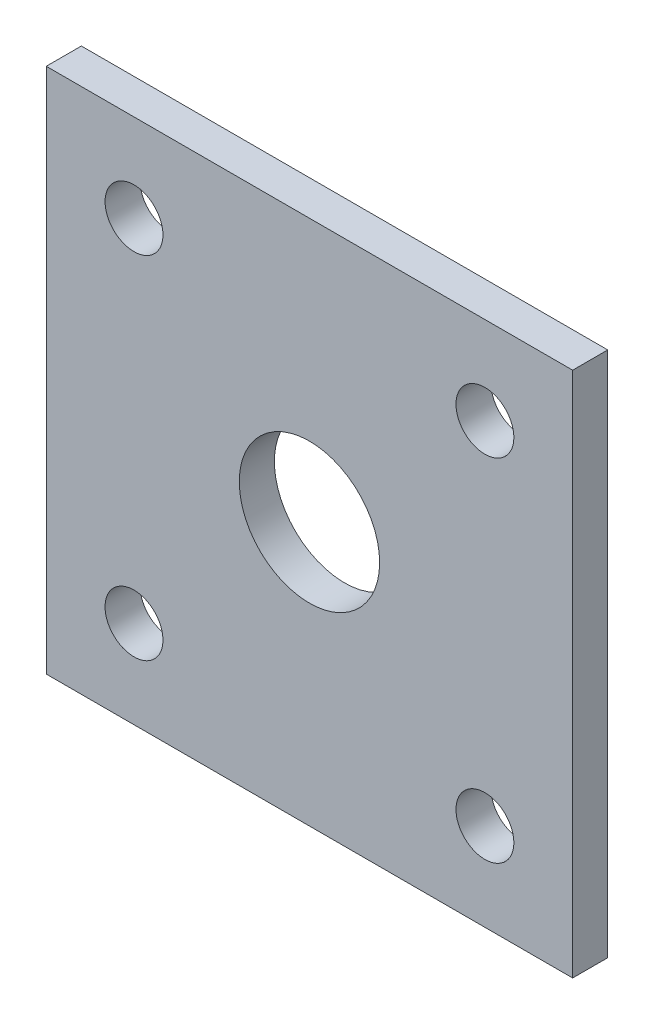
ISO-10303-21;
HEADER;
FILE_DESCRIPTION(('STEP AP214'),'2;1');
FILE_NAME('part.step','',(''),(''),'','','');
FILE_SCHEMA(('AUTOMOTIVE_DESIGN { 1 0 10303 214 1 1 1 1 }'));
ENDSEC;
DATA;
#1=APPLICATION_CONTEXT('core data for automotive mechanical design processes');
#2=APPLICATION_PROTOCOL_DEFINITION('international standard','automotive_design',2000,#1);
#3=PRODUCT_CONTEXT('',#1,'mechanical');
#4=PRODUCT('Part','Part','',(#3));
#5=PRODUCT_RELATED_PRODUCT_CATEGORY('part','',(#4));
#6=PRODUCT_DEFINITION_FORMATION('','',#4);
#7=PRODUCT_DEFINITION_CONTEXT('part definition',#1,'design');
#8=PRODUCT_DEFINITION('design','',#6,#7);
#9=PRODUCT_DEFINITION_SHAPE('','',#8);
#10=(LENGTH_UNIT() NAMED_UNIT(*) SI_UNIT(.MILLI.,.METRE.));
#11=(NAMED_UNIT(*) PLANE_ANGLE_UNIT() SI_UNIT($,.RADIAN.));
#12=(NAMED_UNIT(*) SI_UNIT($,.STERADIAN.) SOLID_ANGLE_UNIT());
#13=UNCERTAINTY_MEASURE_WITH_UNIT(LENGTH_MEASURE(1.E-05),#10,'distance_accuracy_value','');
#14=(GEOMETRIC_REPRESENTATION_CONTEXT(3) GLOBAL_UNCERTAINTY_ASSIGNED_CONTEXT((#13)) GLOBAL_UNIT_ASSIGNED_CONTEXT((#10,
#11,#12)) REPRESENTATION_CONTEXT('',''));
#15=CARTESIAN_POINT('',(0.,0.,0.));
#16=DIRECTION('',(0.,0.,1.));
#17=DIRECTION('',(1.,0.,0.));
#18=AXIS2_PLACEMENT_3D('',#15,#16,#17);
#19=CARTESIAN_POINT('',(0.,0.,2.));
#20=DIRECTION('',(0.,0.,1.));
#21=DIRECTION('',(1.,0.,0.));
#22=AXIS2_PLACEMENT_3D('',#19,#20,#21);
#23=PLANE('',#22);
#24=CARTESIAN_POINT('',(-21.2913444685399,4.54255955253956,2.));
#25=DIRECTION('',(0.,0.,1.));
#26=DIRECTION('',(1.,0.,0.));
#27=AXIS2_PLACEMENT_3D('',#24,#25,#26);
#28=CIRCLE('',#27,1.64999999999999);
#29=CARTESIAN_POINT('',(-19.6413444685399,4.54255955253956,2.));
#30=VERTEX_POINT('',#29);
#31=EDGE_CURVE('E127',#30,#30,#28,.T.);
#32=ORIENTED_EDGE('',*,*,#31,.F.);
#33=EDGE_LOOP('',(#32));
#34=FACE_BOUND('',#33,.T.);
#35=CARTESIAN_POINT('',(-31.2913444685399,14.5425595525395,2.));
#36=DIRECTION('',(0.,0.,1.));
#37=DIRECTION('',(1.,0.,0.));
#38=AXIS2_PLACEMENT_3D('',#35,#36,#37);
#39=CIRCLE('',#38,4.);
#40=CARTESIAN_POINT('',(-27.2913444685399,14.5425595525395,2.));
#41=VERTEX_POINT('',#40);
#42=EDGE_CURVE('E115',#41,#41,#39,.T.);
#43=ORIENTED_EDGE('',*,*,#42,.F.);
#44=EDGE_LOOP('',(#43));
#45=FACE_BOUND('',#44,.T.);
#46=DIRECTION('',(0.,-1.,0.));
#47=VECTOR('',#46,1.);
#48=CARTESIAN_POINT('',(-46.2913444685401,29.5425595525393,2.));
#49=LINE('',#48,#47);
#50=CARTESIAN_POINT('',(-46.2913444685401,29.5425595525393,2.));
#51=VERTEX_POINT('',#50);
#52=CARTESIAN_POINT('',(-46.2913444685401,-0.457440447460652,2.));
#53=VERTEX_POINT('',#52);
#54=EDGE_CURVE('E85',#51,#53,#49,.T.);
#55=ORIENTED_EDGE('',*,*,#54,.T.);
#56=DIRECTION('',(1.,0.,0.));
#57=VECTOR('',#56,1.);
#58=CARTESIAN_POINT('',(-46.2913444685401,-0.457440447460652,2.));
#59=LINE('',#58,#57);
#60=CARTESIAN_POINT('',(-16.2913444685401,-0.457440447460652,2.));
#61=VERTEX_POINT('',#60);
#62=EDGE_CURVE('E80',#53,#61,#59,.T.);
#63=ORIENTED_EDGE('',*,*,#62,.T.);
#64=DIRECTION('',(0.,1.,0.));
#65=VECTOR('',#64,1.);
#66=CARTESIAN_POINT('',(-16.2913444685401,29.5425595525393,2.));
#67=LINE('',#66,#65);
#68=CARTESIAN_POINT('',(-16.2913444685401,29.5425595525393,2.));
#69=VERTEX_POINT('',#68);
#70=EDGE_CURVE('E83',#61,#69,#67,.T.);
#71=ORIENTED_EDGE('',*,*,#70,.T.);
#72=DIRECTION('',(-1.,0.,0.));
#73=VECTOR('',#72,1.);
#74=CARTESIAN_POINT('',(-46.2913444685401,29.5425595525393,2.));
#75=LINE('',#74,#73);
#76=EDGE_CURVE('E50',#69,#51,#75,.T.);
#77=ORIENTED_EDGE('',*,*,#76,.T.);
#78=EDGE_LOOP('',(#55,#63,#71,#77));
#79=FACE_BOUND('',#78,.T.);
#80=CARTESIAN_POINT('',(-41.2913444685401,24.5425595525393,2.));
#81=DIRECTION('',(0.,0.,1.));
#82=DIRECTION('',(1.,0.,0.));
#83=AXIS2_PLACEMENT_3D('',#80,#81,#82);
#84=CIRCLE('',#83,1.65);
#85=CARTESIAN_POINT('',(-39.6413444685401,24.5425595525393,2.));
#86=VERTEX_POINT('',#85);
#87=EDGE_CURVE('E100',#86,#86,#84,.T.);
#88=ORIENTED_EDGE('',*,*,#87,.F.);
#89=EDGE_LOOP('',(#88));
#90=FACE_BOUND('',#89,.T.);
#91=CARTESIAN_POINT('',(-21.29134446854,24.5425595525396,2.));
#92=DIRECTION('',(0.,0.,1.));
#93=DIRECTION('',(1.,0.,0.));
#94=AXIS2_PLACEMENT_3D('',#91,#92,#93);
#95=CIRCLE('',#94,1.65);
#96=CARTESIAN_POINT('',(-19.64134446854,24.5425595525396,2.));
#97=VERTEX_POINT('',#96);
#98=EDGE_CURVE('E121',#97,#97,#95,.T.);
#99=ORIENTED_EDGE('',*,*,#98,.F.);
#100=EDGE_LOOP('',(#99));
#101=FACE_BOUND('',#100,.T.);
#102=CARTESIAN_POINT('',(-41.2913444685399,4.54255955253945,2.));
#103=DIRECTION('',(0.,0.,1.));
#104=DIRECTION('',(1.,0.,0.));
#105=AXIS2_PLACEMENT_3D('',#102,#103,#104);
#106=CIRCLE('',#105,1.65);
#107=CARTESIAN_POINT('',(-39.6413444685399,4.54255955253945,2.));
#108=VERTEX_POINT('',#107);
#109=EDGE_CURVE('E133',#108,#108,#106,.T.);
#110=ORIENTED_EDGE('',*,*,#109,.F.);
#111=EDGE_LOOP('',(#110));
#112=FACE_BOUND('',#111,.T.);
#113=ADVANCED_FACE('F33',(#34,#45,#79,#90,#101,#112),#23,.T.);
#114=CARTESIAN_POINT('',(0.,0.,0.));
#115=DIRECTION('',(0.,0.,1.));
#116=DIRECTION('',(1.,0.,0.));
#117=AXIS2_PLACEMENT_3D('',#114,#115,#116);
#118=PLANE('',#117);
#119=DIRECTION('',(0.,-1.,0.));
#120=VECTOR('',#119,1.);
#121=CARTESIAN_POINT('',(-46.2913444685401,29.5425595525393,0.));
#122=LINE('',#121,#120);
#123=CARTESIAN_POINT('',(-46.2913444685401,29.5425595525393,0.));
#124=VERTEX_POINT('',#123);
#125=CARTESIAN_POINT('',(-46.2913444685401,-0.457440447460652,0.));
#126=VERTEX_POINT('',#125);
#127=EDGE_CURVE('E97',#124,#126,#122,.T.);
#128=ORIENTED_EDGE('',*,*,#127,.F.);
#129=DIRECTION('',(-1.,0.,0.));
#130=VECTOR('',#129,1.);
#131=CARTESIAN_POINT('',(-46.2913444685401,29.5425595525393,0.));
#132=LINE('',#131,#130);
#133=CARTESIAN_POINT('',(-16.2913444685401,29.5425595525393,0.));
#134=VERTEX_POINT('',#133);
#135=EDGE_CURVE('E73',#134,#124,#132,.T.);
#136=ORIENTED_EDGE('',*,*,#135,.F.);
#137=DIRECTION('',(0.,1.,0.));
#138=VECTOR('',#137,1.);
#139=CARTESIAN_POINT('',(-16.2913444685401,29.5425595525393,0.));
#140=LINE('',#139,#138);
#141=CARTESIAN_POINT('',(-16.2913444685401,-0.457440447460652,0.));
#142=VERTEX_POINT('',#141);
#143=EDGE_CURVE('E67',#142,#134,#140,.T.);
#144=ORIENTED_EDGE('',*,*,#143,.F.);
#145=DIRECTION('',(1.,0.,0.));
#146=VECTOR('',#145,1.);
#147=CARTESIAN_POINT('',(-46.2913444685401,-0.457440447460652,0.));
#148=LINE('',#147,#146);
#149=EDGE_CURVE('E89',#126,#142,#148,.T.);
#150=ORIENTED_EDGE('',*,*,#149,.F.);
#151=EDGE_LOOP('',(#128,#136,#144,#150));
#152=FACE_BOUND('',#151,.T.);
#153=CARTESIAN_POINT('',(-41.2913444685401,24.5425595525393,0.));
#154=DIRECTION('',(0.,0.,1.));
#155=DIRECTION('',(1.,0.,0.));
#156=AXIS2_PLACEMENT_3D('',#153,#154,#155);
#157=CIRCLE('',#156,1.65);
#158=CARTESIAN_POINT('',(-39.6413444685401,24.5425595525393,0.));
#159=VERTEX_POINT('',#158);
#160=EDGE_CURVE('E112',#159,#159,#157,.T.);
#161=ORIENTED_EDGE('',*,*,#160,.T.);
#162=EDGE_LOOP('',(#161));
#163=FACE_BOUND('',#162,.T.);
#164=CARTESIAN_POINT('',(-31.2913444685399,14.5425595525395,0.));
#165=DIRECTION('',(0.,0.,1.));
#166=DIRECTION('',(1.,0.,0.));
#167=AXIS2_PLACEMENT_3D('',#164,#165,#166);
#168=CIRCLE('',#167,4.);
#169=CARTESIAN_POINT('',(-27.2913444685399,14.5425595525395,0.));
#170=VERTEX_POINT('',#169);
#171=EDGE_CURVE('E118',#170,#170,#168,.T.);
#172=ORIENTED_EDGE('',*,*,#171,.T.);
#173=EDGE_LOOP('',(#172));
#174=FACE_BOUND('',#173,.T.);
#175=CARTESIAN_POINT('',(-21.29134446854,24.5425595525396,0.));
#176=DIRECTION('',(0.,0.,1.));
#177=DIRECTION('',(1.,0.,0.));
#178=AXIS2_PLACEMENT_3D('',#175,#176,#177);
#179=CIRCLE('',#178,1.65);
#180=CARTESIAN_POINT('',(-19.64134446854,24.5425595525396,0.));
#181=VERTEX_POINT('',#180);
#182=EDGE_CURVE('E124',#181,#181,#179,.T.);
#183=ORIENTED_EDGE('',*,*,#182,.T.);
#184=EDGE_LOOP('',(#183));
#185=FACE_BOUND('',#184,.T.);
#186=CARTESIAN_POINT('',(-21.2913444685399,4.54255955253956,0.));
#187=DIRECTION('',(0.,0.,1.));
#188=DIRECTION('',(1.,0.,0.));
#189=AXIS2_PLACEMENT_3D('',#186,#187,#188);
#190=CIRCLE('',#189,1.64999999999999);
#191=CARTESIAN_POINT('',(-19.6413444685399,4.54255955253956,0.));
#192=VERTEX_POINT('',#191);
#193=EDGE_CURVE('E130',#192,#192,#190,.T.);
#194=ORIENTED_EDGE('',*,*,#193,.T.);
#195=EDGE_LOOP('',(#194));
#196=FACE_BOUND('',#195,.T.);
#197=CARTESIAN_POINT('',(-41.2913444685399,4.54255955253945,0.));
#198=DIRECTION('',(0.,0.,1.));
#199=DIRECTION('',(1.,0.,0.));
#200=AXIS2_PLACEMENT_3D('',#197,#198,#199);
#201=CIRCLE('',#200,1.65);
#202=CARTESIAN_POINT('',(-39.6413444685399,4.54255955253945,0.));
#203=VERTEX_POINT('',#202);
#204=EDGE_CURVE('E136',#203,#203,#201,.T.);
#205=ORIENTED_EDGE('',*,*,#204,.T.);
#206=EDGE_LOOP('',(#205));
#207=FACE_BOUND('',#206,.T.);
#208=ADVANCED_FACE('F108',(#152,#163,#174,#185,#196,#207),#118,.F.);
#209=CARTESIAN_POINT('',(-46.2913444685401,29.5425595525393,2.));
#210=DIRECTION('',(1.,0.,0.));
#211=DIRECTION('',(0.,1.,0.));
#212=AXIS2_PLACEMENT_3D('',#209,#210,#211);
#213=PLANE('',#212);
#214=ORIENTED_EDGE('',*,*,#127,.T.);
#215=DIRECTION('',(0.,0.,-1.));
#216=VECTOR('',#215,1.);
#217=CARTESIAN_POINT('',(-46.2913444685401,-0.457440447460652,2.));
#218=LINE('',#217,#216);
#219=EDGE_CURVE('E11',#53,#126,#218,.T.);
#220=ORIENTED_EDGE('',*,*,#219,.F.);
#221=ORIENTED_EDGE('',*,*,#54,.F.);
#222=DIRECTION('',(0.,0.,-1.));
#223=VECTOR('',#222,1.);
#224=CARTESIAN_POINT('',(-46.2913444685401,29.5425595525393,2.));
#225=LINE('',#224,#223);
#226=EDGE_CURVE('E93',#51,#124,#225,.T.);
#227=ORIENTED_EDGE('',*,*,#226,.T.);
#228=EDGE_LOOP('',(#214,#220,#221,#227));
#229=FACE_BOUND('',#228,.T.);
#230=ADVANCED_FACE('F35',(#229),#213,.F.);
#231=CARTESIAN_POINT('',(-46.2913444685401,-0.457440447460652,2.));
#232=DIRECTION('',(0.,1.,0.));
#233=DIRECTION('',(0.,0.,1.));
#234=AXIS2_PLACEMENT_3D('',#231,#232,#233);
#235=PLANE('',#234);
#236=ORIENTED_EDGE('',*,*,#149,.T.);
#237=DIRECTION('',(0.,0.,-1.));
#238=VECTOR('',#237,1.);
#239=CARTESIAN_POINT('',(-16.2913444685401,-0.457440447460652,2.));
#240=LINE('',#239,#238);
#241=EDGE_CURVE('E42',#61,#142,#240,.T.);
#242=ORIENTED_EDGE('',*,*,#241,.F.);
#243=ORIENTED_EDGE('',*,*,#62,.F.);
#244=ORIENTED_EDGE('',*,*,#219,.T.);
#245=EDGE_LOOP('',(#236,#242,#243,#244));
#246=FACE_BOUND('',#245,.T.);
#247=ADVANCED_FACE('F88',(#246),#235,.F.);
#248=CARTESIAN_POINT('',(-16.2913444685401,29.5425595525393,2.));
#249=DIRECTION('',(-1.,0.,0.));
#250=DIRECTION('',(0.,-1.,0.));
#251=AXIS2_PLACEMENT_3D('',#248,#249,#250);
#252=PLANE('',#251);
#253=ORIENTED_EDGE('',*,*,#143,.T.);
#254=DIRECTION('',(0.,0.,-1.));
#255=VECTOR('',#254,1.);
#256=CARTESIAN_POINT('',(-16.2913444685401,29.5425595525393,2.));
#257=LINE('',#256,#255);
#258=EDGE_CURVE('E90',#69,#134,#257,.T.);
#259=ORIENTED_EDGE('',*,*,#258,.F.);
#260=ORIENTED_EDGE('',*,*,#70,.F.);
#261=ORIENTED_EDGE('',*,*,#241,.T.);
#262=EDGE_LOOP('',(#253,#259,#260,#261));
#263=FACE_BOUND('',#262,.T.);
#264=ADVANCED_FACE('F91',(#263),#252,.F.);
#265=CARTESIAN_POINT('',(-46.2913444685401,29.5425595525393,2.));
#266=DIRECTION('',(0.,-1.,0.));
#267=DIRECTION('',(0.,0.,-1.));
#268=AXIS2_PLACEMENT_3D('',#265,#266,#267);
#269=PLANE('',#268);
#270=ORIENTED_EDGE('',*,*,#135,.T.);
#271=ORIENTED_EDGE('',*,*,#226,.F.);
#272=ORIENTED_EDGE('',*,*,#76,.F.);
#273=ORIENTED_EDGE('',*,*,#258,.T.);
#274=EDGE_LOOP('',(#270,#271,#272,#273));
#275=FACE_BOUND('',#274,.T.);
#276=ADVANCED_FACE('F105',(#275),#269,.F.);
#277=CARTESIAN_POINT('',(-41.2913444685401,24.5425595525393,2.));
#278=DIRECTION('',(0.,0.,-1.));
#279=DIRECTION('',(-1.,0.,0.));
#280=AXIS2_PLACEMENT_3D('',#277,#278,#279);
#281=CYLINDRICAL_SURFACE('',#280,1.65);
#282=ORIENTED_EDGE('',*,*,#87,.T.);
#283=EDGE_LOOP('',(#282));
#284=FACE_BOUND('',#283,.T.);
#285=ORIENTED_EDGE('',*,*,#160,.F.);
#286=EDGE_LOOP('',(#285));
#287=FACE_BOUND('',#286,.T.);
#288=ADVANCED_FACE('F155',(#284,#287),#281,.F.);
#289=CARTESIAN_POINT('',(-31.2913444685399,14.5425595525395,2.));
#290=DIRECTION('',(0.,0.,-1.));
#291=DIRECTION('',(-1.,0.,0.));
#292=AXIS2_PLACEMENT_3D('',#289,#290,#291);
#293=CYLINDRICAL_SURFACE('',#292,4.);
#294=ORIENTED_EDGE('',*,*,#42,.T.);
#295=EDGE_LOOP('',(#294));
#296=FACE_BOUND('',#295,.T.);
#297=ORIENTED_EDGE('',*,*,#171,.F.);
#298=EDGE_LOOP('',(#297));
#299=FACE_BOUND('',#298,.T.);
#300=ADVANCED_FACE('F201',(#296,#299),#293,.F.);
#301=CARTESIAN_POINT('',(-21.29134446854,24.5425595525396,2.));
#302=DIRECTION('',(0.,0.,-1.));
#303=DIRECTION('',(-1.,0.,0.));
#304=AXIS2_PLACEMENT_3D('',#301,#302,#303);
#305=CYLINDRICAL_SURFACE('',#304,1.65);
#306=ORIENTED_EDGE('',*,*,#98,.T.);
#307=EDGE_LOOP('',(#306));
#308=FACE_BOUND('',#307,.T.);
#309=ORIENTED_EDGE('',*,*,#182,.F.);
#310=EDGE_LOOP('',(#309));
#311=FACE_BOUND('',#310,.T.);
#312=ADVANCED_FACE('F209',(#308,#311),#305,.F.);
#313=CARTESIAN_POINT('',(-21.2913444685399,4.54255955253956,2.));
#314=DIRECTION('',(0.,0.,-1.));
#315=DIRECTION('',(-1.,0.,0.));
#316=AXIS2_PLACEMENT_3D('',#313,#314,#315);
#317=CYLINDRICAL_SURFACE('',#316,1.64999999999999);
#318=ORIENTED_EDGE('',*,*,#31,.T.);
#319=EDGE_LOOP('',(#318));
#320=FACE_BOUND('',#319,.T.);
#321=ORIENTED_EDGE('',*,*,#193,.F.);
#322=EDGE_LOOP('',(#321));
#323=FACE_BOUND('',#322,.T.);
#324=ADVANCED_FACE('F217',(#320,#323),#317,.F.);
#325=CARTESIAN_POINT('',(-41.2913444685399,4.54255955253945,2.));
#326=DIRECTION('',(0.,0.,-1.));
#327=DIRECTION('',(-1.,0.,0.));
#328=AXIS2_PLACEMENT_3D('',#325,#326,#327);
#329=CYLINDRICAL_SURFACE('',#328,1.65);
#330=ORIENTED_EDGE('',*,*,#109,.T.);
#331=EDGE_LOOP('',(#330));
#332=FACE_BOUND('',#331,.T.);
#333=ORIENTED_EDGE('',*,*,#204,.F.);
#334=EDGE_LOOP('',(#333));
#335=FACE_BOUND('',#334,.T.);
#336=ADVANCED_FACE('F142',(#332,#335),#329,.F.);
#337=CLOSED_SHELL('',(#113,#208,#230,#247,#264,#276,#288,#300,#312,#324,#336));
#338=MANIFOLD_SOLID_BREP('B2',#337);
#339=ADVANCED_BREP_SHAPE_REPRESENTATION('',(#18,#338),#14);
#340=SHAPE_DEFINITION_REPRESENTATION(#9,#339);
ENDSEC;
END-ISO-10303-21;
